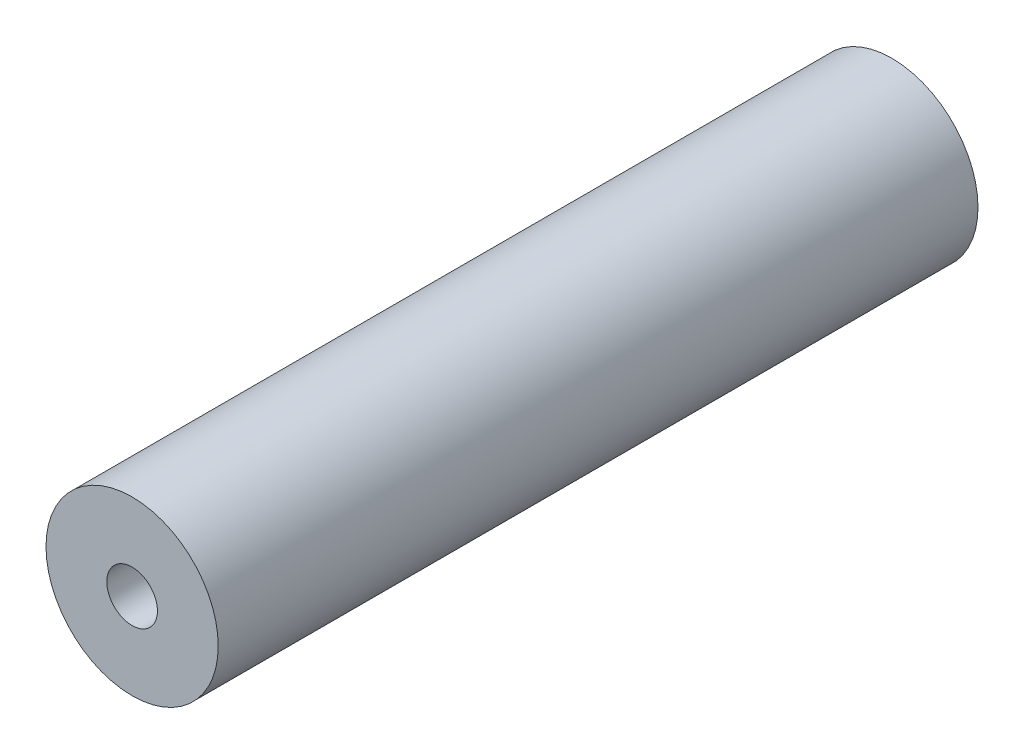
ISO-10303-21;
HEADER;
FILE_DESCRIPTION(('STEP AP214'),'2;1');
FILE_NAME('part.step','',(''),(''),'','','');
FILE_SCHEMA(('AUTOMOTIVE_DESIGN { 1 0 10303 214 1 1 1 1 }'));
ENDSEC;
DATA;
#1=APPLICATION_CONTEXT('core data for automotive mechanical design processes');
#2=APPLICATION_PROTOCOL_DEFINITION('international standard','automotive_design',2000,#1);
#3=PRODUCT_CONTEXT('',#1,'mechanical');
#4=PRODUCT('Part','Part','',(#3));
#5=PRODUCT_RELATED_PRODUCT_CATEGORY('part','',(#4));
#6=PRODUCT_DEFINITION_FORMATION('','',#4);
#7=PRODUCT_DEFINITION_CONTEXT('part definition',#1,'design');
#8=PRODUCT_DEFINITION('design','',#6,#7);
#9=PRODUCT_DEFINITION_SHAPE('','',#8);
#10=(LENGTH_UNIT() NAMED_UNIT(*) SI_UNIT(.MILLI.,.METRE.));
#11=(NAMED_UNIT(*) PLANE_ANGLE_UNIT() SI_UNIT($,.RADIAN.));
#12=(NAMED_UNIT(*) SI_UNIT($,.STERADIAN.) SOLID_ANGLE_UNIT());
#13=UNCERTAINTY_MEASURE_WITH_UNIT(LENGTH_MEASURE(1.E-05),#10,'distance_accuracy_value','');
#14=(GEOMETRIC_REPRESENTATION_CONTEXT(3) GLOBAL_UNCERTAINTY_ASSIGNED_CONTEXT((#13)) GLOBAL_UNIT_ASSIGNED_CONTEXT((#10,
#11,#12)) REPRESENTATION_CONTEXT('',''));
#15=CARTESIAN_POINT('',(0.,0.,0.));
#16=DIRECTION('',(0.,0.,1.));
#17=DIRECTION('',(1.,0.,0.));
#18=AXIS2_PLACEMENT_3D('',#15,#16,#17);
#19=CARTESIAN_POINT('',(0.,0.,150.));
#20=DIRECTION('',(0.,0.,-1.));
#21=DIRECTION('',(-1.,0.,0.));
#22=AXIS2_PLACEMENT_3D('',#19,#20,#21);
#23=CYLINDRICAL_SURFACE('',#22,17.);
#24=CARTESIAN_POINT('',(0.,0.,150.));
#25=DIRECTION('',(0.,0.,1.));
#26=DIRECTION('',(1.,0.,0.));
#27=AXIS2_PLACEMENT_3D('',#24,#25,#26);
#28=CIRCLE('',#27,17.);
#29=CARTESIAN_POINT('',(17.,0.,150.));
#30=VERTEX_POINT('',#29);
#31=EDGE_CURVE('E10',#30,#30,#28,.T.);
#32=ORIENTED_EDGE('',*,*,#31,.F.);
#33=EDGE_LOOP('',(#32));
#34=FACE_BOUND('',#33,.T.);
#35=CARTESIAN_POINT('',(0.,0.,0.));
#36=DIRECTION('',(0.,0.,1.));
#37=DIRECTION('',(1.,0.,0.));
#38=AXIS2_PLACEMENT_3D('',#35,#36,#37);
#39=CIRCLE('',#38,17.);
#40=CARTESIAN_POINT('',(17.,0.,0.));
#41=VERTEX_POINT('',#40);
#42=EDGE_CURVE('E36',#41,#41,#39,.T.);
#43=ORIENTED_EDGE('',*,*,#42,.T.);
#44=EDGE_LOOP('',(#43));
#45=FACE_BOUND('',#44,.T.);
#46=ADVANCED_FACE('F33',(#34,#45),#23,.T.);
#47=CARTESIAN_POINT('',(0.,0.,150.));
#48=DIRECTION('',(0.,0.,1.));
#49=DIRECTION('',(1.,0.,0.));
#50=AXIS2_PLACEMENT_3D('',#47,#48,#49);
#51=PLANE('',#50);
#52=CARTESIAN_POINT('',(0.,0.,150.));
#53=DIRECTION('',(0.,0.,1.));
#54=DIRECTION('',(1.,0.,0.));
#55=AXIS2_PLACEMENT_3D('',#52,#53,#54);
#56=CIRCLE('',#55,5.);
#57=CARTESIAN_POINT('',(5.,0.,150.));
#58=VERTEX_POINT('',#57);
#59=EDGE_CURVE('E45',#58,#58,#56,.T.);
#60=ORIENTED_EDGE('',*,*,#59,.F.);
#61=EDGE_LOOP('',(#60));
#62=FACE_BOUND('',#61,.T.);
#63=ORIENTED_EDGE('',*,*,#31,.T.);
#64=EDGE_LOOP('',(#63));
#65=FACE_BOUND('',#64,.T.);
#66=ADVANCED_FACE('F60',(#62,#65),#51,.T.);
#67=CARTESIAN_POINT('',(0.,0.,0.));
#68=DIRECTION('',(0.,0.,1.));
#69=DIRECTION('',(1.,0.,0.));
#70=AXIS2_PLACEMENT_3D('',#67,#68,#69);
#71=PLANE('',#70);
#72=CARTESIAN_POINT('',(0.,0.,0.));
#73=DIRECTION('',(0.,0.,1.));
#74=DIRECTION('',(1.,0.,0.));
#75=AXIS2_PLACEMENT_3D('',#72,#73,#74);
#76=CIRCLE('',#75,5.);
#77=CARTESIAN_POINT('',(5.,0.,0.));
#78=VERTEX_POINT('',#77);
#79=EDGE_CURVE('E43',#78,#78,#76,.T.);
#80=ORIENTED_EDGE('',*,*,#79,.T.);
#81=EDGE_LOOP('',(#80));
#82=FACE_BOUND('',#81,.T.);
#83=ORIENTED_EDGE('',*,*,#42,.F.);
#84=EDGE_LOOP('',(#83));
#85=FACE_BOUND('',#84,.T.);
#86=ADVANCED_FACE('F51',(#82,#85),#71,.F.);
#87=CARTESIAN_POINT('',(0.,0.,0.));
#88=DIRECTION('',(0.,0.,1.));
#89=DIRECTION('',(1.,0.,0.));
#90=AXIS2_PLACEMENT_3D('',#87,#88,#89);
#91=CYLINDRICAL_SURFACE('',#90,5.);
#92=ORIENTED_EDGE('',*,*,#79,.F.);
#93=EDGE_LOOP('',(#92));
#94=FACE_BOUND('',#93,.T.);
#95=ORIENTED_EDGE('',*,*,#59,.T.);
#96=EDGE_LOOP('',(#95));
#97=FACE_BOUND('',#96,.T.);
#98=ADVANCED_FACE('F54',(#94,#97),#91,.F.);
#99=CLOSED_SHELL('',(#46,#66,#86,#98));
#100=MANIFOLD_SOLID_BREP('B2',#99);
#101=ADVANCED_BREP_SHAPE_REPRESENTATION('',(#18,#100),#14);
#102=SHAPE_DEFINITION_REPRESENTATION(#9,#101);
ENDSEC;
END-ISO-10303-21;
